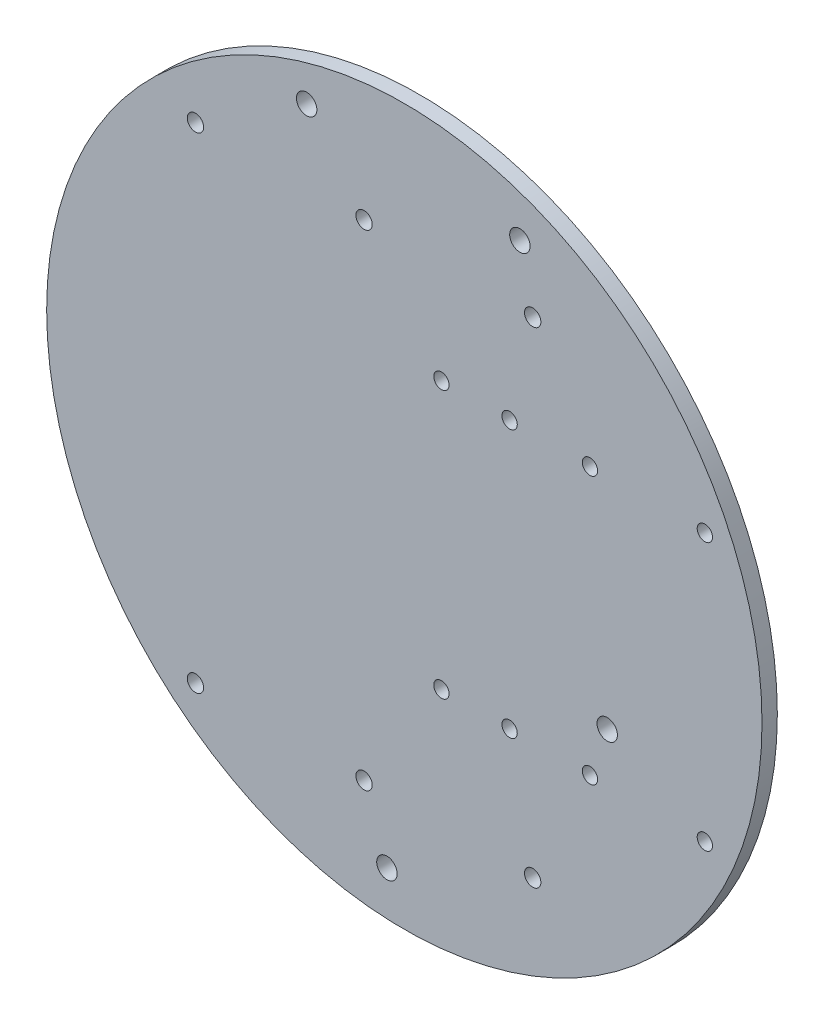
ISO-10303-21;
HEADER;
FILE_DESCRIPTION(('STEP AP214'),'2;1');
FILE_NAME('part.step','',(''),(''),'','','');
FILE_SCHEMA(('AUTOMOTIVE_DESIGN { 1 0 10303 214 1 1 1 1 }'));
ENDSEC;
DATA;
#1=APPLICATION_CONTEXT('core data for automotive mechanical design processes');
#2=APPLICATION_PROTOCOL_DEFINITION('international standard','automotive_design',2000,#1);
#3=PRODUCT_CONTEXT('',#1,'mechanical');
#4=PRODUCT('Part','Part','',(#3));
#5=PRODUCT_RELATED_PRODUCT_CATEGORY('part','',(#4));
#6=PRODUCT_DEFINITION_FORMATION('','',#4);
#7=PRODUCT_DEFINITION_CONTEXT('part definition',#1,'design');
#8=PRODUCT_DEFINITION('design','',#6,#7);
#9=PRODUCT_DEFINITION_SHAPE('','',#8);
#10=(LENGTH_UNIT() NAMED_UNIT(*) SI_UNIT(.MILLI.,.METRE.));
#11=(NAMED_UNIT(*) PLANE_ANGLE_UNIT() SI_UNIT($,.RADIAN.));
#12=(NAMED_UNIT(*) SI_UNIT($,.STERADIAN.) SOLID_ANGLE_UNIT());
#13=UNCERTAINTY_MEASURE_WITH_UNIT(LENGTH_MEASURE(1.E-05),#10,'distance_accuracy_value','');
#14=(GEOMETRIC_REPRESENTATION_CONTEXT(3) GLOBAL_UNCERTAINTY_ASSIGNED_CONTEXT((#13)) GLOBAL_UNIT_ASSIGNED_CONTEXT((#10,
#11,#12)) REPRESENTATION_CONTEXT('',''));
#15=CARTESIAN_POINT('',(0.,0.,0.));
#16=DIRECTION('',(0.,0.,1.));
#17=DIRECTION('',(1.,0.,0.));
#18=AXIS2_PLACEMENT_3D('',#15,#16,#17);
#19=CARTESIAN_POINT('',(148.639036188339,185.242759861496,70.9869348817875));
#20=DIRECTION('',(0.,0.,1.));
#21=DIRECTION('',(0.,-1.,0.));
#22=AXIS2_PLACEMENT_3D('',#19,#20,#21);
#23=PLANE('',#22);
#24=CARTESIAN_POINT('',(140.756490825019,136.55907748717,70.9869348817875));
#25=DIRECTION('',(0.,0.,1.));
#26=DIRECTION('',(-1.,0.,0.));
#27=AXIS2_PLACEMENT_3D('',#24,#25,#26);
#28=CIRCLE('',#27,1.60006282918066);
#29=CARTESIAN_POINT('',(142.3565536542,136.55907748717,70.9869348817875));
#30=VERTEX_POINT('',#29);
#31=EDGE_CURVE('E207',#30,#30,#28,.T.);
#32=ORIENTED_EDGE('',*,*,#31,.T.);
#33=EDGE_LOOP('',(#32));
#34=FACE_BOUND('',#33,.T.);
#35=CARTESIAN_POINT('',(140.756490825022,231.55907748717,70.9869348817875));
#36=DIRECTION('',(0.,0.,1.));
#37=DIRECTION('',(-1.,0.,0.));
#38=AXIS2_PLACEMENT_3D('',#35,#36,#37);
#39=CIRCLE('',#38,1.60006282918066);
#40=CARTESIAN_POINT('',(142.356553654203,231.55907748717,70.9869348817875));
#41=VERTEX_POINT('',#40);
#42=EDGE_CURVE('E291',#41,#41,#39,.T.);
#43=ORIENTED_EDGE('',*,*,#42,.T.);
#44=EDGE_LOOP('',(#43));
#45=FACE_BOUND('',#44,.T.);
#46=CARTESIAN_POINT('',(107.756619615154,231.558988059508,70.9869348817875));
#47=DIRECTION('',(0.,0.,1.));
#48=DIRECTION('',(-1.,0.,0.));
#49=AXIS2_PLACEMENT_3D('',#46,#47,#48);
#50=CIRCLE('',#49,1.59990750905056);
#51=CARTESIAN_POINT('',(109.356527124204,231.558988059508,70.9869348817875));
#52=VERTEX_POINT('',#51);
#53=EDGE_CURVE('E262',#52,#52,#50,.T.);
#54=ORIENTED_EDGE('',*,*,#53,.T.);
#55=EDGE_LOOP('',(#54));
#56=FACE_BOUND('',#55,.T.);
#57=CARTESIAN_POINT('',(173.756660309311,136.558761719092,70.9869348817875));
#58=DIRECTION('',(0.,0.,1.));
#59=DIRECTION('',(-1.,0.,0.));
#60=AXIS2_PLACEMENT_3D('',#57,#58,#59);
#61=CIRCLE('',#60,1.59969521979783);
#62=CARTESIAN_POINT('',(175.356355529108,136.558761719092,70.9869348817875));
#63=VERTEX_POINT('',#62);
#64=EDGE_CURVE('E361',#63,#63,#61,.T.);
#65=ORIENTED_EDGE('',*,*,#64,.T.);
#66=EDGE_LOOP('',(#65));
#67=FACE_BOUND('',#66,.T.);
#68=CARTESIAN_POINT('',(173.756790127714,231.558961676995,70.9869348817874));
#69=DIRECTION('',(0.,0.,1.));
#70=DIRECTION('',(-1.,0.,0.));
#71=AXIS2_PLACEMENT_3D('',#68,#69,#70);
#72=CIRCLE('',#71,1.59974375953401);
#73=CARTESIAN_POINT('',(175.356533887248,231.558961676995,70.9869348817874));
#74=VERTEX_POINT('',#73);
#75=EDGE_CURVE('E212',#74,#74,#72,.T.);
#76=ORIENTED_EDGE('',*,*,#75,.T.);
#77=EDGE_LOOP('',(#76));
#78=FACE_BOUND('',#77,.T.);
#79=CARTESIAN_POINT('',(107.756507056726,136.559066872958,70.9869348817875));
#80=DIRECTION('',(0.,0.,1.));
#81=DIRECTION('',(-1.,0.,0.));
#82=AXIS2_PLACEMENT_3D('',#79,#80,#81);
#83=CIRCLE('',#82,1.60004439415132);
#84=CARTESIAN_POINT('',(109.356551450877,136.559066872958,70.9869348817875));
#85=VERTEX_POINT('',#84);
#86=EDGE_CURVE('E223',#85,#85,#83,.T.);
#87=ORIENTED_EDGE('',*,*,#86,.T.);
#88=EDGE_LOOP('',(#87));
#89=FACE_BOUND('',#88,.T.);
#90=CARTESIAN_POINT('',(129.516333991706,245.590960865801,70.9869348817875));
#91=DIRECTION('',(0.,0.,1.));
#92=DIRECTION('',(-1.,0.,0.));
#93=AXIS2_PLACEMENT_3D('',#90,#91,#92);
#94=CIRCLE('',#93,2.);
#95=CARTESIAN_POINT('',(131.516333991706,245.590960865801,70.9869348817875));
#96=VERTEX_POINT('',#95);
#97=EDGE_CURVE('E279',#96,#96,#94,.T.);
#98=ORIENTED_EDGE('',*,*,#97,.T.);
#99=EDGE_LOOP('',(#98));
#100=FACE_BOUND('',#99,.T.);
#101=CARTESIAN_POINT('',(145.2349590222,123.971230326429,70.9869348817875));
#102=DIRECTION('',(0.,0.,1.));
#103=DIRECTION('',(-1.,0.,0.));
#104=AXIS2_PLACEMENT_3D('',#101,#102,#103);
#105=CIRCLE('',#104,2.);
#106=CARTESIAN_POINT('',(147.2349590222,123.971230326429,70.9869348817875));
#107=VERTEX_POINT('',#106);
#108=EDGE_CURVE('E180',#107,#107,#105,.T.);
#109=ORIENTED_EDGE('',*,*,#108,.T.);
#110=EDGE_LOOP('',(#109));
#111=FACE_BOUND('',#110,.T.);
#112=CARTESIAN_POINT('',(171.255427323054,243.327019787303,70.9869348817875));
#113=DIRECTION('',(0.,0.,1.));
#114=DIRECTION('',(-1.,0.,0.));
#115=AXIS2_PLACEMENT_3D('',#112,#113,#114);
#116=CIRCLE('',#115,2.);
#117=CARTESIAN_POINT('',(173.255427323054,243.327019787303,70.9869348817875));
#118=VERTEX_POINT('',#117);
#119=EDGE_CURVE('E327',#118,#118,#116,.T.);
#120=ORIENTED_EDGE('',*,*,#119,.T.);
#121=EDGE_LOOP('',(#120));
#122=FACE_BOUND('',#121,.T.);
#123=CARTESIAN_POINT('',(188.343031145969,169.020090634888,70.9869348817875));
#124=DIRECTION('',(0.,0.,1.));
#125=DIRECTION('',(-1.,0.,0.));
#126=AXIS2_PLACEMENT_3D('',#123,#124,#125);
#127=CIRCLE('',#126,2.);
#128=CARTESIAN_POINT('',(190.343031145969,169.020090634888,70.9869348817875));
#129=VERTEX_POINT('',#128);
#130=EDGE_CURVE('E286',#129,#129,#127,.T.);
#131=ORIENTED_EDGE('',*,*,#130,.T.);
#132=EDGE_LOOP('',(#131));
#133=FACE_BOUND('',#132,.T.);
#134=CARTESIAN_POINT('',(169.240616461506,159.548892774122,70.9869348817875));
#135=DIRECTION('',(0.,0.,1.));
#136=DIRECTION('',(-1.,0.,0.));
#137=AXIS2_PLACEMENT_3D('',#134,#135,#136);
#138=CIRCLE('',#137,1.5);
#139=CARTESIAN_POINT('',(170.740616461506,159.548892774122,70.9869348817875));
#140=VERTEX_POINT('',#139);
#141=EDGE_CURVE('E243',#140,#140,#138,.T.);
#142=ORIENTED_EDGE('',*,*,#141,.T.);
#143=EDGE_LOOP('',(#142));
#144=FACE_BOUND('',#143,.T.);
#145=CARTESIAN_POINT('',(155.896367779251,211.863149814179,70.9869348817875));
#146=DIRECTION('',(0.,0.,1.));
#147=DIRECTION('',(-1.,0.,0.));
#148=AXIS2_PLACEMENT_3D('',#145,#146,#147);
#149=CIRCLE('',#148,1.5);
#150=CARTESIAN_POINT('',(157.396367779251,211.863149814179,70.9869348817875));
#151=VERTEX_POINT('',#150);
#152=EDGE_CURVE('E238',#151,#151,#149,.T.);
#153=ORIENTED_EDGE('',*,*,#152,.T.);
#154=EDGE_LOOP('',(#153));
#155=FACE_BOUND('',#154,.T.);
#156=CARTESIAN_POINT('',(155.896367779251,159.548892774122,70.9869348817875));
#157=DIRECTION('',(0.,0.,1.));
#158=DIRECTION('',(-1.,0.,0.));
#159=AXIS2_PLACEMENT_3D('',#156,#157,#158);
#160=CIRCLE('',#159,1.5);
#161=CARTESIAN_POINT('',(157.396367779251,159.548892774122,70.9869348817875));
#162=VERTEX_POINT('',#161);
#163=EDGE_CURVE('E214',#162,#162,#160,.T.);
#164=ORIENTED_EDGE('',*,*,#163,.T.);
#165=EDGE_LOOP('',(#164));
#166=FACE_BOUND('',#165,.T.);
#167=CARTESIAN_POINT('',(184.969183147323,159.548892774122,70.9869348817875));
#168=DIRECTION('',(0.,0.,1.));
#169=DIRECTION('',(-1.,0.,0.));
#170=AXIS2_PLACEMENT_3D('',#167,#168,#169);
#171=CIRCLE('',#170,1.5);
#172=CARTESIAN_POINT('',(186.469183147323,159.548892774122,70.9869348817875));
#173=VERTEX_POINT('',#172);
#174=EDGE_CURVE('E228',#173,#173,#171,.T.);
#175=ORIENTED_EDGE('',*,*,#174,.T.);
#176=EDGE_LOOP('',(#175));
#177=FACE_BOUND('',#176,.T.);
#178=CARTESIAN_POINT('',(169.240616461506,211.863149814179,70.9869348817874));
#179=DIRECTION('',(0.,0.,1.));
#180=DIRECTION('',(-1.,0.,0.));
#181=AXIS2_PLACEMENT_3D('',#178,#179,#180);
#182=CIRCLE('',#181,1.5);
#183=CARTESIAN_POINT('',(170.740616461506,211.863149814179,70.9869348817874));
#184=VERTEX_POINT('',#183);
#185=EDGE_CURVE('E299',#184,#184,#182,.T.);
#186=ORIENTED_EDGE('',*,*,#185,.T.);
#187=EDGE_LOOP('',(#186));
#188=FACE_BOUND('',#187,.T.);
#189=CARTESIAN_POINT('',(184.969183147323,211.863149814179,70.9869348817875));
#190=DIRECTION('',(0.,0.,1.));
#191=DIRECTION('',(-1.,0.,0.));
#192=AXIS2_PLACEMENT_3D('',#189,#190,#191);
#193=CIRCLE('',#192,1.5);
#194=CARTESIAN_POINT('',(186.469183147323,211.863149814179,70.9869348817875));
#195=VERTEX_POINT('',#194);
#196=EDGE_CURVE('E196',#195,#195,#193,.T.);
#197=ORIENTED_EDGE('',*,*,#196,.T.);
#198=EDGE_LOOP('',(#197));
#199=FACE_BOUND('',#198,.T.);
#200=CARTESIAN_POINT('',(207.449910240939,211.863149814181,70.9869348817875));
#201=DIRECTION('',(0.,0.,1.));
#202=DIRECTION('',(-1.,0.,0.));
#203=AXIS2_PLACEMENT_3D('',#200,#201,#202);
#204=CIRCLE('',#203,1.5);
#205=CARTESIAN_POINT('',(208.949910240939,211.863149814181,70.9869348817875));
#206=VERTEX_POINT('',#205);
#207=EDGE_CURVE('E323',#206,#206,#204,.T.);
#208=ORIENTED_EDGE('',*,*,#207,.T.);
#209=EDGE_LOOP('',(#208));
#210=FACE_BOUND('',#209,.T.);
#211=CARTESIAN_POINT('',(207.449910240939,159.548892774124,70.9869348817875));
#212=DIRECTION('',(0.,0.,1.));
#213=DIRECTION('',(-1.,0.,0.));
#214=AXIS2_PLACEMENT_3D('',#211,#212,#213);
#215=CIRCLE('',#214,1.5);
#216=CARTESIAN_POINT('',(208.949910240939,159.548892774124,70.9869348817875));
#217=VERTEX_POINT('',#216);
#218=EDGE_CURVE('E203',#217,#217,#215,.T.);
#219=ORIENTED_EDGE('',*,*,#218,.T.);
#220=EDGE_LOOP('',(#219));
#221=FACE_BOUND('',#220,.T.);
#222=CARTESIAN_POINT('',(148.639036188339,185.242759861496,70.9869348817875));
#223=DIRECTION('',(0.,0.,1.));
#224=DIRECTION('',(1.,0.,0.));
#225=AXIS2_PLACEMENT_3D('',#222,#223,#224);
#226=CIRCLE('',#225,70.);
#227=CARTESIAN_POINT('',(78.6390361883393,185.242759861496,70.9869348817875));
#228=VERTEX_POINT('',#227);
#229=EDGE_CURVE('E10',#228,#228,#226,.T.);
#230=ORIENTED_EDGE('',*,*,#229,.F.);
#231=EDGE_LOOP('',(#230));
#232=FACE_BOUND('',#231,.T.);
#233=ADVANCED_FACE('F16',(#34,#45,#56,#67,#78,#89,#100,#111,#122,#133,#144,#155,#166,#177,#188,
#199,#210,#221,#232),#23,.F.);
#234=CARTESIAN_POINT('',(148.639036188339,185.242759861496,73.9869348817875));
#235=DIRECTION('',(0.,0.,1.));
#236=DIRECTION('',(0.,-1.,0.));
#237=AXIS2_PLACEMENT_3D('',#234,#235,#236);
#238=PLANE('',#237);
#239=CARTESIAN_POINT('',(140.756490825019,136.55907748717,73.9869348817875));
#240=DIRECTION('',(0.,0.,-1.));
#241=DIRECTION('',(-1.,0.,0.));
#242=AXIS2_PLACEMENT_3D('',#239,#240,#241);
#243=CIRCLE('',#242,1.60006282918066);
#244=CARTESIAN_POINT('',(142.3565536542,136.55907748717,73.9869348817875));
#245=VERTEX_POINT('',#244);
#246=EDGE_CURVE('E268',#245,#245,#243,.T.);
#247=ORIENTED_EDGE('',*,*,#246,.T.);
#248=EDGE_LOOP('',(#247));
#249=FACE_BOUND('',#248,.T.);
#250=CARTESIAN_POINT('',(140.756490825022,231.55907748717,73.9869348817875));
#251=DIRECTION('',(0.,0.,-1.));
#252=DIRECTION('',(-1.,0.,0.));
#253=AXIS2_PLACEMENT_3D('',#250,#251,#252);
#254=CIRCLE('',#253,1.60006282918066);
#255=CARTESIAN_POINT('',(142.356553654203,231.55907748717,73.9869348817874));
#256=VERTEX_POINT('',#255);
#257=EDGE_CURVE('E204',#256,#256,#254,.T.);
#258=ORIENTED_EDGE('',*,*,#257,.T.);
#259=EDGE_LOOP('',(#258));
#260=FACE_BOUND('',#259,.T.);
#261=CARTESIAN_POINT('',(107.756619615154,231.558988059508,73.9869348817875));
#262=DIRECTION('',(0.,0.,-1.));
#263=DIRECTION('',(-1.,0.,0.));
#264=AXIS2_PLACEMENT_3D('',#261,#262,#263);
#265=CIRCLE('',#264,1.59990750905056);
#266=CARTESIAN_POINT('',(109.356527124204,231.558988059508,73.9869348817875));
#267=VERTEX_POINT('',#266);
#268=EDGE_CURVE('E287',#267,#267,#265,.T.);
#269=ORIENTED_EDGE('',*,*,#268,.T.);
#270=EDGE_LOOP('',(#269));
#271=FACE_BOUND('',#270,.T.);
#272=CARTESIAN_POINT('',(173.756660309311,136.558761719092,73.9869348817875));
#273=DIRECTION('',(0.,0.,-1.));
#274=DIRECTION('',(-1.,0.,0.));
#275=AXIS2_PLACEMENT_3D('',#272,#273,#274);
#276=CIRCLE('',#275,1.59969521979783);
#277=CARTESIAN_POINT('',(175.356355529108,136.558761719092,73.9869348817875));
#278=VERTEX_POINT('',#277);
#279=EDGE_CURVE('E381',#278,#278,#276,.T.);
#280=ORIENTED_EDGE('',*,*,#279,.T.);
#281=EDGE_LOOP('',(#280));
#282=FACE_BOUND('',#281,.T.);
#283=CARTESIAN_POINT('',(173.756790127714,231.558961676995,73.9869348817874));
#284=DIRECTION('',(0.,0.,-1.));
#285=DIRECTION('',(-1.,0.,0.));
#286=AXIS2_PLACEMENT_3D('',#283,#284,#285);
#287=CIRCLE('',#286,1.59974375953401);
#288=CARTESIAN_POINT('',(175.356533887248,231.558961676995,73.9869348817874));
#289=VERTEX_POINT('',#288);
#290=EDGE_CURVE('E359',#289,#289,#287,.T.);
#291=ORIENTED_EDGE('',*,*,#290,.T.);
#292=EDGE_LOOP('',(#291));
#293=FACE_BOUND('',#292,.T.);
#294=CARTESIAN_POINT('',(107.756507056726,136.559066872958,73.9869348817875));
#295=DIRECTION('',(0.,0.,-1.));
#296=DIRECTION('',(-1.,0.,0.));
#297=AXIS2_PLACEMENT_3D('',#294,#295,#296);
#298=CIRCLE('',#297,1.60004439415132);
#299=CARTESIAN_POINT('',(109.356551450877,136.559066872958,73.9869348817875));
#300=VERTEX_POINT('',#299);
#301=EDGE_CURVE('E209',#300,#300,#298,.T.);
#302=ORIENTED_EDGE('',*,*,#301,.T.);
#303=EDGE_LOOP('',(#302));
#304=FACE_BOUND('',#303,.T.);
#305=CARTESIAN_POINT('',(129.516333991706,245.590960865801,73.9869348817875));
#306=DIRECTION('',(0.,0.,-1.));
#307=DIRECTION('',(-1.,0.,0.));
#308=AXIS2_PLACEMENT_3D('',#305,#306,#307);
#309=CIRCLE('',#308,2.);
#310=CARTESIAN_POINT('',(131.516333991706,245.590960865801,73.9869348817875));
#311=VERTEX_POINT('',#310);
#312=EDGE_CURVE('E241',#311,#311,#309,.T.);
#313=ORIENTED_EDGE('',*,*,#312,.T.);
#314=EDGE_LOOP('',(#313));
#315=FACE_BOUND('',#314,.T.);
#316=CARTESIAN_POINT('',(145.2349590222,123.971230326429,73.9869348817875));
#317=DIRECTION('',(0.,0.,-1.));
#318=DIRECTION('',(-1.,0.,0.));
#319=AXIS2_PLACEMENT_3D('',#316,#317,#318);
#320=CIRCLE('',#319,2.);
#321=CARTESIAN_POINT('',(147.2349590222,123.971230326429,73.9869348817875));
#322=VERTEX_POINT('',#321);
#323=EDGE_CURVE('E181',#322,#322,#320,.T.);
#324=ORIENTED_EDGE('',*,*,#323,.T.);
#325=EDGE_LOOP('',(#324));
#326=FACE_BOUND('',#325,.T.);
#327=CARTESIAN_POINT('',(171.255427323054,243.327019787303,73.9869348817875));
#328=DIRECTION('',(0.,0.,-1.));
#329=DIRECTION('',(-1.,0.,0.));
#330=AXIS2_PLACEMENT_3D('',#327,#328,#329);
#331=CIRCLE('',#330,2.);
#332=CARTESIAN_POINT('',(173.255427323054,243.327019787303,73.9869348817875));
#333=VERTEX_POINT('',#332);
#334=EDGE_CURVE('E186',#333,#333,#331,.T.);
#335=ORIENTED_EDGE('',*,*,#334,.T.);
#336=EDGE_LOOP('',(#335));
#337=FACE_BOUND('',#336,.T.);
#338=CARTESIAN_POINT('',(188.343031145969,169.020090634888,73.9869348817875));
#339=DIRECTION('',(0.,0.,-1.));
#340=DIRECTION('',(-1.,0.,0.));
#341=AXIS2_PLACEMENT_3D('',#338,#339,#340);
#342=CIRCLE('',#341,2.);
#343=CARTESIAN_POINT('',(190.343031145969,169.020090634888,73.9869348817875));
#344=VERTEX_POINT('',#343);
#345=EDGE_CURVE('E330',#344,#344,#342,.T.);
#346=ORIENTED_EDGE('',*,*,#345,.T.);
#347=EDGE_LOOP('',(#346));
#348=FACE_BOUND('',#347,.T.);
#349=CARTESIAN_POINT('',(169.240616461506,159.548892774122,73.9869348817875));
#350=DIRECTION('',(0.,0.,-1.));
#351=DIRECTION('',(-1.,0.,0.));
#352=AXIS2_PLACEMENT_3D('',#349,#350,#351);
#353=CIRCLE('',#352,1.5);
#354=CARTESIAN_POINT('',(170.740616461506,159.548892774122,73.9869348817875));
#355=VERTEX_POINT('',#354);
#356=EDGE_CURVE('E258',#355,#355,#353,.T.);
#357=ORIENTED_EDGE('',*,*,#356,.T.);
#358=EDGE_LOOP('',(#357));
#359=FACE_BOUND('',#358,.T.);
#360=CARTESIAN_POINT('',(155.896367779251,211.863149814179,73.9869348817875));
#361=DIRECTION('',(0.,0.,-1.));
#362=DIRECTION('',(-1.,0.,0.));
#363=AXIS2_PLACEMENT_3D('',#360,#361,#362);
#364=CIRCLE('',#363,1.5);
#365=CARTESIAN_POINT('',(157.396367779251,211.863149814179,73.9869348817875));
#366=VERTEX_POINT('',#365);
#367=EDGE_CURVE('E237',#366,#366,#364,.T.);
#368=ORIENTED_EDGE('',*,*,#367,.T.);
#369=EDGE_LOOP('',(#368));
#370=FACE_BOUND('',#369,.T.);
#371=CARTESIAN_POINT('',(155.896367779251,159.548892774122,73.9869348817875));
#372=DIRECTION('',(0.,0.,-1.));
#373=DIRECTION('',(-1.,0.,0.));
#374=AXIS2_PLACEMENT_3D('',#371,#372,#373);
#375=CIRCLE('',#374,1.5);
#376=CARTESIAN_POINT('',(157.396367779251,159.548892774122,73.9869348817875));
#377=VERTEX_POINT('',#376);
#378=EDGE_CURVE('E232',#377,#377,#375,.T.);
#379=ORIENTED_EDGE('',*,*,#378,.T.);
#380=EDGE_LOOP('',(#379));
#381=FACE_BOUND('',#380,.T.);
#382=CARTESIAN_POINT('',(184.969183147323,159.548892774122,73.9869348817875));
#383=DIRECTION('',(0.,0.,-1.));
#384=DIRECTION('',(-1.,0.,0.));
#385=AXIS2_PLACEMENT_3D('',#382,#383,#384);
#386=CIRCLE('',#385,1.5);
#387=CARTESIAN_POINT('',(186.469183147323,159.548892774122,73.9869348817875));
#388=VERTEX_POINT('',#387);
#389=EDGE_CURVE('E219',#388,#388,#386,.T.);
#390=ORIENTED_EDGE('',*,*,#389,.T.);
#391=EDGE_LOOP('',(#390));
#392=FACE_BOUND('',#391,.T.);
#393=CARTESIAN_POINT('',(169.240616461506,211.863149814179,73.9869348817875));
#394=DIRECTION('',(0.,0.,-1.));
#395=DIRECTION('',(-1.,0.,0.));
#396=AXIS2_PLACEMENT_3D('',#393,#394,#395);
#397=CIRCLE('',#396,1.5);
#398=CARTESIAN_POINT('',(170.740616461506,211.863149814179,73.9869348817874));
#399=VERTEX_POINT('',#398);
#400=EDGE_CURVE('E304',#399,#399,#397,.T.);
#401=ORIENTED_EDGE('',*,*,#400,.T.);
#402=EDGE_LOOP('',(#401));
#403=FACE_BOUND('',#402,.T.);
#404=CARTESIAN_POINT('',(184.969183147323,211.863149814179,73.9869348817875));
#405=DIRECTION('',(0.,0.,-1.));
#406=DIRECTION('',(-1.,0.,0.));
#407=AXIS2_PLACEMENT_3D('',#404,#405,#406);
#408=CIRCLE('',#407,1.5);
#409=CARTESIAN_POINT('',(186.469183147323,211.863149814179,73.9869348817875));
#410=VERTEX_POINT('',#409);
#411=EDGE_CURVE('E296',#410,#410,#408,.T.);
#412=ORIENTED_EDGE('',*,*,#411,.T.);
#413=EDGE_LOOP('',(#412));
#414=FACE_BOUND('',#413,.T.);
#415=CARTESIAN_POINT('',(207.449910240939,211.863149814181,73.9869348817875));
#416=DIRECTION('',(0.,0.,-1.));
#417=DIRECTION('',(-1.,0.,0.));
#418=AXIS2_PLACEMENT_3D('',#415,#416,#417);
#419=CIRCLE('',#418,1.5);
#420=CARTESIAN_POINT('',(208.949910240939,211.863149814181,73.9869348817875));
#421=VERTEX_POINT('',#420);
#422=EDGE_CURVE('E305',#421,#421,#419,.T.);
#423=ORIENTED_EDGE('',*,*,#422,.T.);
#424=EDGE_LOOP('',(#423));
#425=FACE_BOUND('',#424,.T.);
#426=CARTESIAN_POINT('',(207.449910240939,159.548892774124,73.9869348817875));
#427=DIRECTION('',(0.,0.,-1.));
#428=DIRECTION('',(-1.,0.,0.));
#429=AXIS2_PLACEMENT_3D('',#426,#427,#428);
#430=CIRCLE('',#429,1.5);
#431=CARTESIAN_POINT('',(208.949910240939,159.548892774124,73.9869348817875));
#432=VERTEX_POINT('',#431);
#433=EDGE_CURVE('E202',#432,#432,#430,.T.);
#434=ORIENTED_EDGE('',*,*,#433,.T.);
#435=EDGE_LOOP('',(#434));
#436=FACE_BOUND('',#435,.T.);
#437=CARTESIAN_POINT('',(148.639036188339,185.242759861496,73.9869348817875));
#438=DIRECTION('',(0.,0.,1.));
#439=DIRECTION('',(1.,0.,0.));
#440=AXIS2_PLACEMENT_3D('',#437,#438,#439);
#441=CIRCLE('',#440,70.);
#442=CARTESIAN_POINT('',(78.6390361883393,185.242759861496,73.9869348817875));
#443=VERTEX_POINT('',#442);
#444=EDGE_CURVE('E264',#443,#443,#441,.T.);
#445=ORIENTED_EDGE('',*,*,#444,.T.);
#446=EDGE_LOOP('',(#445));
#447=FACE_BOUND('',#446,.T.);
#448=ADVANCED_FACE('F413',(#249,#260,#271,#282,#293,#304,#315,#326,#337,#348,#359,#370,#381,
#392,#403,#414,#425,#436,#447),#238,.T.);
#449=CARTESIAN_POINT('',(148.639036188339,185.242759861496,70.9869348817875));
#450=DIRECTION('',(0.,0.,1.));
#451=DIRECTION('',(1.,0.,0.));
#452=AXIS2_PLACEMENT_3D('',#449,#450,#451);
#453=CYLINDRICAL_SURFACE('',#452,70.);
#454=ORIENTED_EDGE('',*,*,#444,.F.);
#455=DIRECTION('',(0.,0.,-1.));
#456=VECTOR('',#455,1.);
#457=CARTESIAN_POINT('',(78.6390361883393,185.242759861496,70.9869348817875));
#458=LINE('',#457,#456);
#459=EDGE_CURVE('E26',#443,#228,#458,.T.);
#460=ORIENTED_EDGE('',*,*,#459,.T.);
#461=ORIENTED_EDGE('',*,*,#229,.T.);
#462=ORIENTED_EDGE('',*,*,#459,.F.);
#463=EDGE_LOOP('',(#454,#460,#461,#462));
#464=FACE_BOUND('',#463,.T.);
#465=ADVANCED_FACE('F435',(#464),#453,.T.);
#466=CARTESIAN_POINT('',(140.756490825019,136.55907748717,70.9869348817875));
#467=DIRECTION('',(0.,0.,1.));
#468=DIRECTION('',(-1.,0.,0.));
#469=AXIS2_PLACEMENT_3D('',#466,#467,#468);
#470=CYLINDRICAL_SURFACE('',#469,1.60006282918066);
#471=ORIENTED_EDGE('',*,*,#31,.F.);
#472=DIRECTION('',(0.,0.,1.));
#473=VECTOR('',#472,1.);
#474=CARTESIAN_POINT('',(142.3565536542,136.55907748717,70.9869348817875));
#475=LINE('',#474,#473);
#476=EDGE_CURVE('E280',#30,#245,#475,.T.);
#477=ORIENTED_EDGE('',*,*,#476,.T.);
#478=ORIENTED_EDGE('',*,*,#246,.F.);
#479=ORIENTED_EDGE('',*,*,#476,.F.);
#480=EDGE_LOOP('',(#471,#477,#478,#479));
#481=FACE_BOUND('',#480,.T.);
#482=ADVANCED_FACE('F444',(#481),#470,.F.);
#483=CARTESIAN_POINT('',(140.756490825022,231.55907748717,70.9869348817875));
#484=DIRECTION('',(0.,0.,1.));
#485=DIRECTION('',(-1.,0.,0.));
#486=AXIS2_PLACEMENT_3D('',#483,#484,#485);
#487=CYLINDRICAL_SURFACE('',#486,1.60006282918066);
#488=ORIENTED_EDGE('',*,*,#42,.F.);
#489=DIRECTION('',(0.,0.,1.));
#490=VECTOR('',#489,1.);
#491=CARTESIAN_POINT('',(142.356553654203,231.55907748717,70.9869348817875));
#492=LINE('',#491,#490);
#493=EDGE_CURVE('E208',#41,#256,#492,.T.);
#494=ORIENTED_EDGE('',*,*,#493,.T.);
#495=ORIENTED_EDGE('',*,*,#257,.F.);
#496=ORIENTED_EDGE('',*,*,#493,.F.);
#497=EDGE_LOOP('',(#488,#494,#495,#496));
#498=FACE_BOUND('',#497,.T.);
#499=ADVANCED_FACE('F449',(#498),#487,.F.);
#500=CARTESIAN_POINT('',(107.756619615154,231.558988059508,70.9869348817875));
#501=DIRECTION('',(0.,0.,1.));
#502=DIRECTION('',(-1.,0.,0.));
#503=AXIS2_PLACEMENT_3D('',#500,#501,#502);
#504=CYLINDRICAL_SURFACE('',#503,1.59990750905056);
#505=ORIENTED_EDGE('',*,*,#53,.F.);
#506=DIRECTION('',(0.,0.,1.));
#507=VECTOR('',#506,1.);
#508=CARTESIAN_POINT('',(109.356527124204,231.558988059508,70.9869348817875));
#509=LINE('',#508,#507);
#510=EDGE_CURVE('E292',#52,#267,#509,.T.);
#511=ORIENTED_EDGE('',*,*,#510,.T.);
#512=ORIENTED_EDGE('',*,*,#268,.F.);
#513=ORIENTED_EDGE('',*,*,#510,.F.);
#514=EDGE_LOOP('',(#505,#511,#512,#513));
#515=FACE_BOUND('',#514,.T.);
#516=ADVANCED_FACE('F471',(#515),#504,.F.);
#517=CARTESIAN_POINT('',(173.756660309311,136.558761719092,70.9869348817875));
#518=DIRECTION('',(0.,0.,1.));
#519=DIRECTION('',(-1.,0.,0.));
#520=AXIS2_PLACEMENT_3D('',#517,#518,#519);
#521=CYLINDRICAL_SURFACE('',#520,1.59969521979783);
#522=ORIENTED_EDGE('',*,*,#64,.F.);
#523=DIRECTION('',(0.,0.,1.));
#524=VECTOR('',#523,1.);
#525=CARTESIAN_POINT('',(175.356355529108,136.558761719092,70.9869348817875));
#526=LINE('',#525,#524);
#527=EDGE_CURVE('E369',#63,#278,#526,.T.);
#528=ORIENTED_EDGE('',*,*,#527,.T.);
#529=ORIENTED_EDGE('',*,*,#279,.F.);
#530=ORIENTED_EDGE('',*,*,#527,.F.);
#531=EDGE_LOOP('',(#522,#528,#529,#530));
#532=FACE_BOUND('',#531,.T.);
#533=ADVANCED_FACE('F474',(#532),#521,.F.);
#534=CARTESIAN_POINT('',(173.756790127714,231.558961676995,70.9869348817874));
#535=DIRECTION('',(0.,0.,1.));
#536=DIRECTION('',(-1.,0.,0.));
#537=AXIS2_PLACEMENT_3D('',#534,#535,#536);
#538=CYLINDRICAL_SURFACE('',#537,1.59974375953401);
#539=ORIENTED_EDGE('',*,*,#75,.F.);
#540=DIRECTION('',(0.,0.,1.));
#541=VECTOR('',#540,1.);
#542=CARTESIAN_POINT('',(175.356533887248,231.558961676995,70.9869348817874));
#543=LINE('',#542,#541);
#544=EDGE_CURVE('E274',#74,#289,#543,.T.);
#545=ORIENTED_EDGE('',*,*,#544,.T.);
#546=ORIENTED_EDGE('',*,*,#290,.F.);
#547=ORIENTED_EDGE('',*,*,#544,.F.);
#548=EDGE_LOOP('',(#539,#545,#546,#547));
#549=FACE_BOUND('',#548,.T.);
#550=ADVANCED_FACE('F492',(#549),#538,.F.);
#551=CARTESIAN_POINT('',(107.756507056726,136.559066872958,70.9869348817875));
#552=DIRECTION('',(0.,0.,1.));
#553=DIRECTION('',(-1.,0.,0.));
#554=AXIS2_PLACEMENT_3D('',#551,#552,#553);
#555=CYLINDRICAL_SURFACE('',#554,1.60004439415132);
#556=ORIENTED_EDGE('',*,*,#86,.F.);
#557=DIRECTION('',(0.,0.,1.));
#558=VECTOR('',#557,1.);
#559=CARTESIAN_POINT('',(109.356551450877,136.559066872958,70.9869348817875));
#560=LINE('',#559,#558);
#561=EDGE_CURVE('E213',#85,#300,#560,.T.);
#562=ORIENTED_EDGE('',*,*,#561,.T.);
#563=ORIENTED_EDGE('',*,*,#301,.F.);
#564=ORIENTED_EDGE('',*,*,#561,.F.);
#565=EDGE_LOOP('',(#556,#562,#563,#564));
#566=FACE_BOUND('',#565,.T.);
#567=ADVANCED_FACE('F489',(#566),#555,.F.);
#568=CARTESIAN_POINT('',(129.516333991706,245.590960865801,70.9869348817875));
#569=DIRECTION('',(0.,0.,1.));
#570=DIRECTION('',(-1.,0.,0.));
#571=AXIS2_PLACEMENT_3D('',#568,#569,#570);
#572=CYLINDRICAL_SURFACE('',#571,2.);
#573=ORIENTED_EDGE('',*,*,#97,.F.);
#574=DIRECTION('',(0.,0.,1.));
#575=VECTOR('',#574,1.);
#576=CARTESIAN_POINT('',(131.516333991706,245.590960865801,70.9869348817875));
#577=LINE('',#576,#575);
#578=EDGE_CURVE('E275',#96,#311,#577,.T.);
#579=ORIENTED_EDGE('',*,*,#578,.T.);
#580=ORIENTED_EDGE('',*,*,#312,.F.);
#581=ORIENTED_EDGE('',*,*,#578,.F.);
#582=EDGE_LOOP('',(#573,#579,#580,#581));
#583=FACE_BOUND('',#582,.T.);
#584=ADVANCED_FACE('F491',(#583),#572,.F.);
#585=CARTESIAN_POINT('',(145.2349590222,123.971230326429,70.9869348817875));
#586=DIRECTION('',(0.,0.,1.));
#587=DIRECTION('',(-1.,0.,0.));
#588=AXIS2_PLACEMENT_3D('',#585,#586,#587);
#589=CYLINDRICAL_SURFACE('',#588,2.);
#590=ORIENTED_EDGE('',*,*,#108,.F.);
#591=DIRECTION('',(0.,0.,1.));
#592=VECTOR('',#591,1.);
#593=CARTESIAN_POINT('',(147.2349590222,123.971230326429,70.9869348817875));
#594=LINE('',#593,#592);
#595=EDGE_CURVE('E19',#107,#322,#594,.T.);
#596=ORIENTED_EDGE('',*,*,#595,.T.);
#597=ORIENTED_EDGE('',*,*,#323,.F.);
#598=ORIENTED_EDGE('',*,*,#595,.F.);
#599=EDGE_LOOP('',(#590,#596,#597,#598));
#600=FACE_BOUND('',#599,.T.);
#601=ADVANCED_FACE('F179',(#600),#589,.F.);
#602=CARTESIAN_POINT('',(171.255427323054,243.327019787303,70.9869348817875));
#603=DIRECTION('',(0.,0.,1.));
#604=DIRECTION('',(-1.,0.,0.));
#605=AXIS2_PLACEMENT_3D('',#602,#603,#604);
#606=CYLINDRICAL_SURFACE('',#605,2.);
#607=ORIENTED_EDGE('',*,*,#119,.F.);
#608=DIRECTION('',(0.,0.,1.));
#609=VECTOR('',#608,1.);
#610=CARTESIAN_POINT('',(173.255427323054,243.327019787303,70.9869348817875));
#611=LINE('',#610,#609);
#612=EDGE_CURVE('E192',#118,#333,#611,.T.);
#613=ORIENTED_EDGE('',*,*,#612,.T.);
#614=ORIENTED_EDGE('',*,*,#334,.F.);
#615=ORIENTED_EDGE('',*,*,#612,.F.);
#616=EDGE_LOOP('',(#607,#613,#614,#615));
#617=FACE_BOUND('',#616,.T.);
#618=ADVANCED_FACE('F410',(#617),#606,.F.);
#619=CARTESIAN_POINT('',(188.343031145969,169.020090634888,70.9869348817875));
#620=DIRECTION('',(0.,0.,1.));
#621=DIRECTION('',(-1.,0.,0.));
#622=AXIS2_PLACEMENT_3D('',#619,#620,#621);
#623=CYLINDRICAL_SURFACE('',#622,2.);
#624=ORIENTED_EDGE('',*,*,#130,.F.);
#625=DIRECTION('',(0.,0.,1.));
#626=VECTOR('',#625,1.);
#627=CARTESIAN_POINT('',(190.343031145969,169.020090634888,70.9869348817875));
#628=LINE('',#627,#626);
#629=EDGE_CURVE('E351',#129,#344,#628,.T.);
#630=ORIENTED_EDGE('',*,*,#629,.T.);
#631=ORIENTED_EDGE('',*,*,#345,.F.);
#632=ORIENTED_EDGE('',*,*,#629,.F.);
#633=EDGE_LOOP('',(#624,#630,#631,#632));
#634=FACE_BOUND('',#633,.T.);
#635=ADVANCED_FACE('F481',(#634),#623,.F.);
#636=CARTESIAN_POINT('',(169.240616461506,159.548892774122,70.9869348817884));
#637=DIRECTION('',(0.,0.,1.));
#638=DIRECTION('',(-1.,0.,0.));
#639=AXIS2_PLACEMENT_3D('',#636,#637,#638);
#640=CYLINDRICAL_SURFACE('',#639,1.5);
#641=ORIENTED_EDGE('',*,*,#141,.F.);
#642=DIRECTION('',(0.,0.,1.));
#643=VECTOR('',#642,1.);
#644=CARTESIAN_POINT('',(170.740616461506,159.548892774122,70.9869348817884));
#645=LINE('',#644,#643);
#646=EDGE_CURVE('E250',#140,#355,#645,.T.);
#647=ORIENTED_EDGE('',*,*,#646,.T.);
#648=ORIENTED_EDGE('',*,*,#356,.F.);
#649=ORIENTED_EDGE('',*,*,#646,.F.);
#650=EDGE_LOOP('',(#641,#647,#648,#649));
#651=FACE_BOUND('',#650,.T.);
#652=ADVANCED_FACE('F464',(#651),#640,.F.);
#653=CARTESIAN_POINT('',(155.896367779251,211.863149814179,70.9869348817884));
#654=DIRECTION('',(0.,0.,1.));
#655=DIRECTION('',(-1.,0.,0.));
#656=AXIS2_PLACEMENT_3D('',#653,#654,#655);
#657=CYLINDRICAL_SURFACE('',#656,1.5);
#658=ORIENTED_EDGE('',*,*,#152,.F.);
#659=DIRECTION('',(0.,0.,1.));
#660=VECTOR('',#659,1.);
#661=CARTESIAN_POINT('',(157.396367779251,211.863149814179,70.9869348817884));
#662=LINE('',#661,#660);
#663=EDGE_CURVE('E233',#151,#366,#662,.T.);
#664=ORIENTED_EDGE('',*,*,#663,.T.);
#665=ORIENTED_EDGE('',*,*,#367,.F.);
#666=ORIENTED_EDGE('',*,*,#663,.F.);
#667=EDGE_LOOP('',(#658,#664,#665,#666));
#668=FACE_BOUND('',#667,.T.);
#669=ADVANCED_FACE('F461',(#668),#657,.F.);
#670=CARTESIAN_POINT('',(155.896367779251,159.548892774122,70.9869348817884));
#671=DIRECTION('',(0.,0.,1.));
#672=DIRECTION('',(-1.,0.,0.));
#673=AXIS2_PLACEMENT_3D('',#670,#671,#672);
#674=CYLINDRICAL_SURFACE('',#673,1.5);
#675=ORIENTED_EDGE('',*,*,#163,.F.);
#676=DIRECTION('',(0.,0.,1.));
#677=VECTOR('',#676,1.);
#678=CARTESIAN_POINT('',(157.396367779251,159.548892774122,70.9869348817884));
#679=LINE('',#678,#677);
#680=EDGE_CURVE('E218',#162,#377,#679,.T.);
#681=ORIENTED_EDGE('',*,*,#680,.T.);
#682=ORIENTED_EDGE('',*,*,#378,.F.);
#683=ORIENTED_EDGE('',*,*,#680,.F.);
#684=EDGE_LOOP('',(#675,#681,#682,#683));
#685=FACE_BOUND('',#684,.T.);
#686=ADVANCED_FACE('F455',(#685),#674,.F.);
#687=CARTESIAN_POINT('',(184.969183147323,159.548892774122,70.9869348817884));
#688=DIRECTION('',(0.,0.,1.));
#689=DIRECTION('',(-1.,0.,0.));
#690=AXIS2_PLACEMENT_3D('',#687,#688,#689);
#691=CYLINDRICAL_SURFACE('',#690,1.5);
#692=ORIENTED_EDGE('',*,*,#174,.F.);
#693=DIRECTION('',(0.,0.,1.));
#694=VECTOR('',#693,1.);
#695=CARTESIAN_POINT('',(186.469183147323,159.548892774122,70.9869348817884));
#696=LINE('',#695,#694);
#697=EDGE_CURVE('E224',#173,#388,#696,.T.);
#698=ORIENTED_EDGE('',*,*,#697,.T.);
#699=ORIENTED_EDGE('',*,*,#389,.F.);
#700=ORIENTED_EDGE('',*,*,#697,.F.);
#701=EDGE_LOOP('',(#692,#698,#699,#700));
#702=FACE_BOUND('',#701,.T.);
#703=ADVANCED_FACE('F451',(#702),#691,.F.);
#704=CARTESIAN_POINT('',(169.240616461506,211.863149814179,70.9869348817884));
#705=DIRECTION('',(0.,0.,1.));
#706=DIRECTION('',(-1.,0.,0.));
#707=AXIS2_PLACEMENT_3D('',#704,#705,#706);
#708=CYLINDRICAL_SURFACE('',#707,1.5);
#709=ORIENTED_EDGE('',*,*,#185,.F.);
#710=DIRECTION('',(0.,0.,1.));
#711=VECTOR('',#710,1.);
#712=CARTESIAN_POINT('',(170.740616461506,211.863149814179,70.9869348817884));
#713=LINE('',#712,#711);
#714=EDGE_CURVE('E310',#184,#399,#713,.T.);
#715=ORIENTED_EDGE('',*,*,#714,.T.);
#716=ORIENTED_EDGE('',*,*,#400,.F.);
#717=ORIENTED_EDGE('',*,*,#714,.F.);
#718=EDGE_LOOP('',(#709,#715,#716,#717));
#719=FACE_BOUND('',#718,.T.);
#720=ADVANCED_FACE('F454',(#719),#708,.F.);
#721=CARTESIAN_POINT('',(184.969183147323,211.863149814179,70.9869348817884));
#722=DIRECTION('',(0.,0.,1.));
#723=DIRECTION('',(-1.,0.,0.));
#724=AXIS2_PLACEMENT_3D('',#721,#722,#723);
#725=CYLINDRICAL_SURFACE('',#724,1.5);
#726=ORIENTED_EDGE('',*,*,#196,.F.);
#727=DIRECTION('',(0.,0.,1.));
#728=VECTOR('',#727,1.);
#729=CARTESIAN_POINT('',(186.469183147323,211.863149814179,70.9869348817884));
#730=LINE('',#729,#728);
#731=EDGE_CURVE('E300',#195,#410,#730,.T.);
#732=ORIENTED_EDGE('',*,*,#731,.T.);
#733=ORIENTED_EDGE('',*,*,#411,.F.);
#734=ORIENTED_EDGE('',*,*,#731,.F.);
#735=EDGE_LOOP('',(#726,#732,#733,#734));
#736=FACE_BOUND('',#735,.T.);
#737=ADVANCED_FACE('F459',(#736),#725,.F.);
#738=CARTESIAN_POINT('',(207.449910240939,211.863149814181,70.9869348817884));
#739=DIRECTION('',(0.,0.,1.));
#740=DIRECTION('',(-1.,0.,0.));
#741=AXIS2_PLACEMENT_3D('',#738,#739,#740);
#742=CYLINDRICAL_SURFACE('',#741,1.5);
#743=ORIENTED_EDGE('',*,*,#207,.F.);
#744=DIRECTION('',(0.,0.,1.));
#745=VECTOR('',#744,1.);
#746=CARTESIAN_POINT('',(208.949910240939,211.863149814181,70.9869348817884));
#747=LINE('',#746,#745);
#748=EDGE_CURVE('E309',#206,#421,#747,.T.);
#749=ORIENTED_EDGE('',*,*,#748,.T.);
#750=ORIENTED_EDGE('',*,*,#422,.F.);
#751=ORIENTED_EDGE('',*,*,#748,.F.);
#752=EDGE_LOOP('',(#743,#749,#750,#751));
#753=FACE_BOUND('',#752,.T.);
#754=ADVANCED_FACE('F466',(#753),#742,.F.);
#755=CARTESIAN_POINT('',(207.449910240939,159.548892774124,70.9869348817884));
#756=DIRECTION('',(0.,0.,1.));
#757=DIRECTION('',(-1.,0.,0.));
#758=AXIS2_PLACEMENT_3D('',#755,#756,#757);
#759=CYLINDRICAL_SURFACE('',#758,1.5);
#760=ORIENTED_EDGE('',*,*,#218,.F.);
#761=DIRECTION('',(0.,0.,1.));
#762=VECTOR('',#761,1.);
#763=CARTESIAN_POINT('',(208.949910240939,159.548892774124,70.9869348817884));
#764=LINE('',#763,#762);
#765=EDGE_CURVE('E198',#217,#432,#764,.T.);
#766=ORIENTED_EDGE('',*,*,#765,.T.);
#767=ORIENTED_EDGE('',*,*,#433,.F.);
#768=ORIENTED_EDGE('',*,*,#765,.F.);
#769=EDGE_LOOP('',(#760,#766,#767,#768));
#770=FACE_BOUND('',#769,.T.);
#771=ADVANCED_FACE('F469',(#770),#759,.F.);
#772=CLOSED_SHELL('',(#233,#448,#465,#482,#499,#516,#533,#550,#567,#584,#601,#618,#635,#652,
#669,#686,#703,#720,#737,#754,#771));
#773=MANIFOLD_SOLID_BREP('B1',#772);
#774=ADVANCED_BREP_SHAPE_REPRESENTATION('',(#18,#773),#14);
#775=SHAPE_DEFINITION_REPRESENTATION(#9,#774);
ENDSEC;
END-ISO-10303-21;
